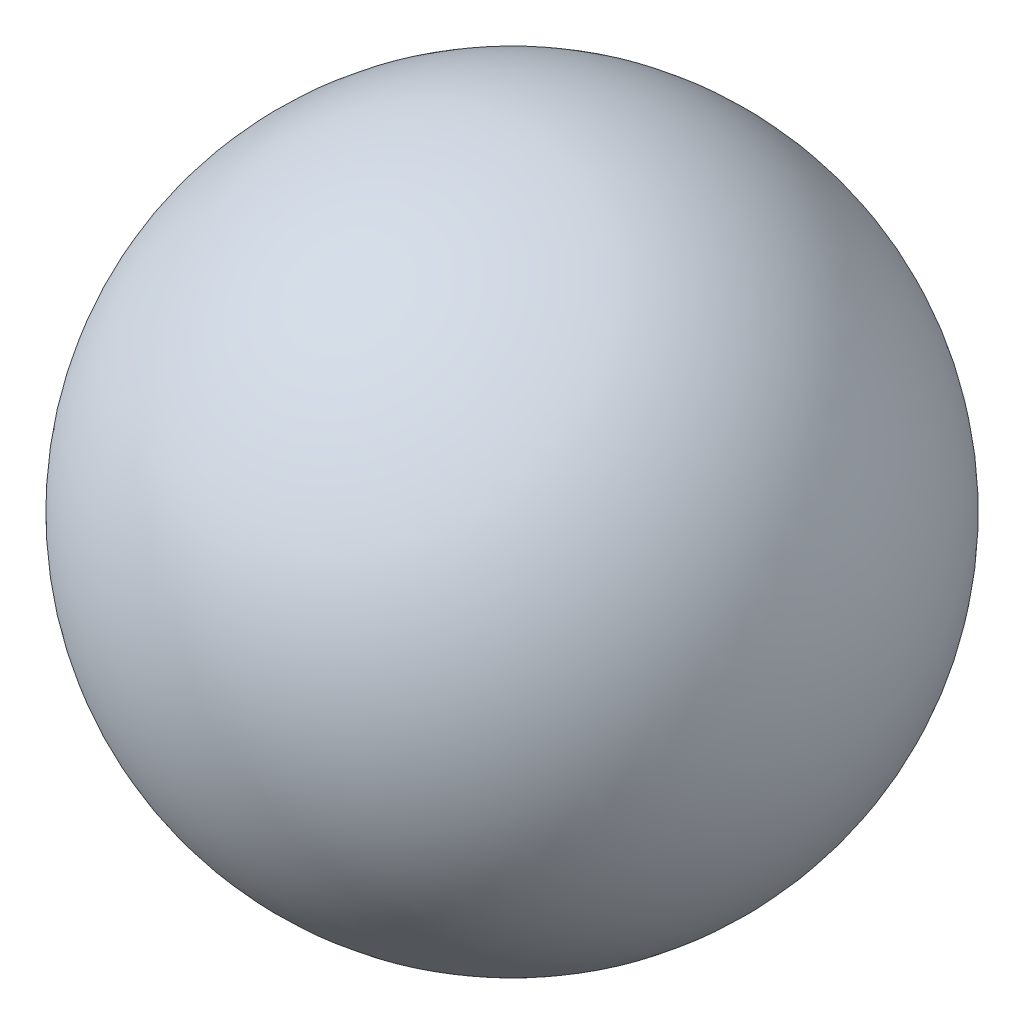
ISO-10303-21;
HEADER;
FILE_DESCRIPTION(('STEP AP214'),'2;1');
FILE_NAME('part.step','',(''),(''),'','','');
FILE_SCHEMA(('AUTOMOTIVE_DESIGN { 1 0 10303 214 1 1 1 1 }'));
ENDSEC;
DATA;
#1=APPLICATION_CONTEXT('core data for automotive mechanical design processes');
#2=APPLICATION_PROTOCOL_DEFINITION('international standard','automotive_design',2000,#1);
#3=PRODUCT_CONTEXT('',#1,'mechanical');
#4=PRODUCT('Part','Part','',(#3));
#5=PRODUCT_RELATED_PRODUCT_CATEGORY('part','',(#4));
#6=PRODUCT_DEFINITION_FORMATION('','',#4);
#7=PRODUCT_DEFINITION_CONTEXT('part definition',#1,'design');
#8=PRODUCT_DEFINITION('design','',#6,#7);
#9=PRODUCT_DEFINITION_SHAPE('','',#8);
#10=(LENGTH_UNIT() NAMED_UNIT(*) SI_UNIT(.MILLI.,.METRE.));
#11=(NAMED_UNIT(*) PLANE_ANGLE_UNIT() SI_UNIT($,.RADIAN.));
#12=(NAMED_UNIT(*) SI_UNIT($,.STERADIAN.) SOLID_ANGLE_UNIT());
#13=UNCERTAINTY_MEASURE_WITH_UNIT(LENGTH_MEASURE(1.E-05),#10,'distance_accuracy_value','');
#14=(GEOMETRIC_REPRESENTATION_CONTEXT(3) GLOBAL_UNCERTAINTY_ASSIGNED_CONTEXT((#13)) GLOBAL_UNIT_ASSIGNED_CONTEXT((#10,
#11,#12)) REPRESENTATION_CONTEXT('',''));
#15=CARTESIAN_POINT('',(0.,0.,0.));
#16=DIRECTION('',(0.,0.,1.));
#17=DIRECTION('',(1.,0.,0.));
#18=AXIS2_PLACEMENT_3D('',#15,#16,#17);
#19=CARTESIAN_POINT('',(0.,0.,0.));
#20=DIRECTION('',(0.,1.,0.));
#21=DIRECTION('',(1.,0.,0.));
#22=AXIS2_PLACEMENT_3D('',#19,#20,#21);
#23=SPHERICAL_SURFACE('',#22,40.);
#24=CARTESIAN_POINT('',(0.,40.,0.));
#25=VERTEX_POINT('',#24);
#26=VERTEX_LOOP('',#25);
#27=FACE_BOUND('',#26,.T.);
#28=ADVANCED_FACE('F29',(#27),#23,.T.);
#29=CLOSED_SHELL('',(#28));
#30=MANIFOLD_SOLID_BREP('B2',#29);
#31=ADVANCED_BREP_SHAPE_REPRESENTATION('',(#18,#30),#14);
#32=SHAPE_DEFINITION_REPRESENTATION(#9,#31);
ENDSEC;
END-ISO-10303-21;
